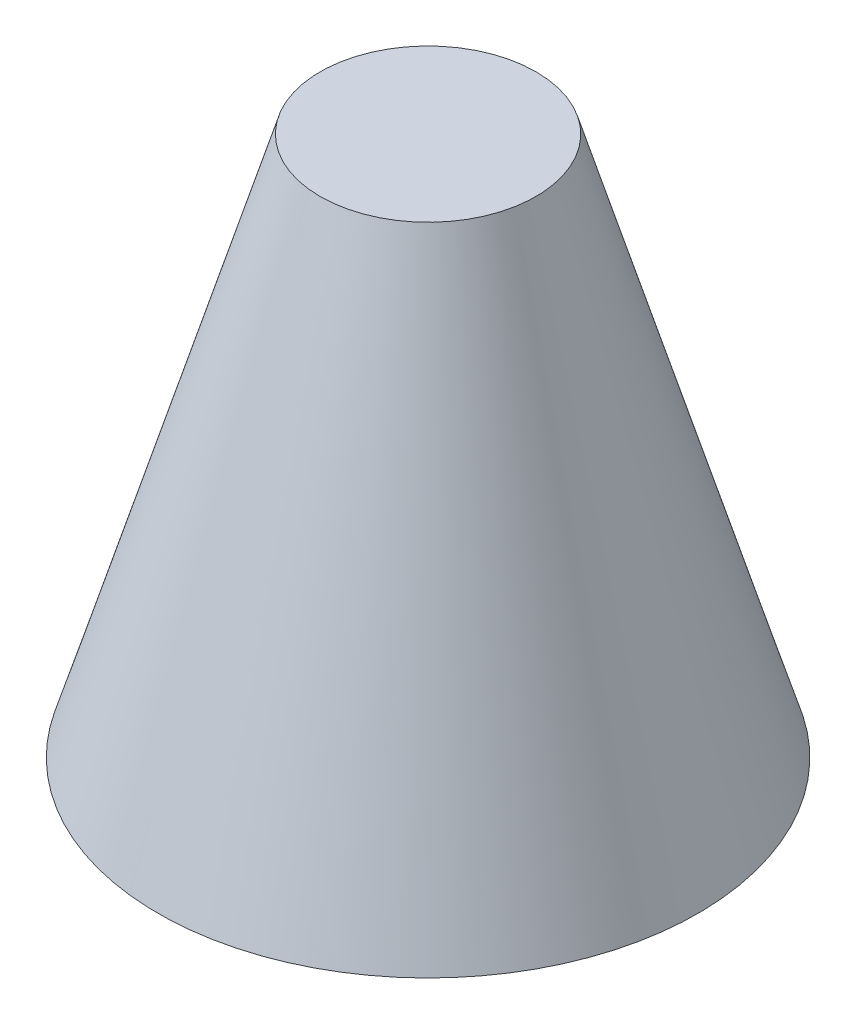
ISO-10303-21;
HEADER;
FILE_DESCRIPTION(('STEP AP214'),'2;1');
FILE_NAME('part.step','',(''),(''),'','','');
FILE_SCHEMA(('AUTOMOTIVE_DESIGN { 1 0 10303 214 1 1 1 1 }'));
ENDSEC;
DATA;
#1=APPLICATION_CONTEXT('core data for automotive mechanical design processes');
#2=APPLICATION_PROTOCOL_DEFINITION('international standard','automotive_design',2000,#1);
#3=PRODUCT_CONTEXT('',#1,'mechanical');
#4=PRODUCT('Part','Part','',(#3));
#5=PRODUCT_RELATED_PRODUCT_CATEGORY('part','',(#4));
#6=PRODUCT_DEFINITION_FORMATION('','',#4);
#7=PRODUCT_DEFINITION_CONTEXT('part definition',#1,'design');
#8=PRODUCT_DEFINITION('design','',#6,#7);
#9=PRODUCT_DEFINITION_SHAPE('','',#8);
#10=(LENGTH_UNIT() NAMED_UNIT(*) SI_UNIT(.MILLI.,.METRE.));
#11=(NAMED_UNIT(*) PLANE_ANGLE_UNIT() SI_UNIT($,.RADIAN.));
#12=(NAMED_UNIT(*) SI_UNIT($,.STERADIAN.) SOLID_ANGLE_UNIT());
#13=UNCERTAINTY_MEASURE_WITH_UNIT(LENGTH_MEASURE(1.E-05),#10,'distance_accuracy_value','');
#14=(GEOMETRIC_REPRESENTATION_CONTEXT(3) GLOBAL_UNCERTAINTY_ASSIGNED_CONTEXT((#13)) GLOBAL_UNIT_ASSIGNED_CONTEXT((#10,
#11,#12)) REPRESENTATION_CONTEXT('',''));
#15=CARTESIAN_POINT('',(0.,0.,0.));
#16=DIRECTION('',(0.,0.,1.));
#17=DIRECTION('',(1.,0.,0.));
#18=AXIS2_PLACEMENT_3D('',#15,#16,#17);
#19=CARTESIAN_POINT('',(0.,0.,0.));
#20=DIRECTION('',(0.,-1.,0.));
#21=DIRECTION('',(0.,0.,-1.));
#22=AXIS2_PLACEMENT_3D('',#19,#20,#21);
#23=PLANE('',#22);
#24=CARTESIAN_POINT('',(0.,0.,0.));
#25=DIRECTION('',(0.,1.,0.));
#26=DIRECTION('',(0.,0.,1.));
#27=AXIS2_PLACEMENT_3D('',#24,#25,#26);
#28=CIRCLE('',#27,4.);
#29=CARTESIAN_POINT('',(0.,0.,4.));
#30=VERTEX_POINT('',#29);
#31=EDGE_CURVE('E51',#30,#30,#28,.T.);
#32=ORIENTED_EDGE('',*,*,#31,.T.);
#33=EDGE_LOOP('',(#32));
#34=FACE_BOUND('',#33,.T.);
#35=CARTESIAN_POINT('',(0.,0.,0.));
#36=DIRECTION('',(0.,-1.,0.));
#37=DIRECTION('',(0.,0.,-1.));
#38=AXIS2_PLACEMENT_3D('',#35,#36,#37);
#39=CIRCLE('',#38,50.);
#40=CARTESIAN_POINT('',(0.,0.,-50.));
#41=VERTEX_POINT('',#40);
#42=EDGE_CURVE('E10',#41,#41,#39,.T.);
#43=ORIENTED_EDGE('',*,*,#42,.T.);
#44=EDGE_LOOP('',(#43));
#45=FACE_BOUND('',#44,.T.);
#46=ADVANCED_FACE('F37',(#34,#45),#23,.T.);
#47=CARTESIAN_POINT('',(0.,0.,0.));
#48=DIRECTION('',(0.,-1.,0.));
#49=DIRECTION('',(0.,0.,-1.));
#50=AXIS2_PLACEMENT_3D('',#47,#48,#49);
#51=CONICAL_SURFACE('',#50,50.,0.291456794477867);
#52=CARTESIAN_POINT('',(0.,100.,0.));
#53=DIRECTION('',(0.,-1.,0.));
#54=DIRECTION('',(0.,0.,-1.));
#55=AXIS2_PLACEMENT_3D('',#52,#53,#54);
#56=CIRCLE('',#55,20.);
#57=CARTESIAN_POINT('',(0.,100.,-20.));
#58=VERTEX_POINT('',#57);
#59=EDGE_CURVE('E43',#58,#58,#56,.T.);
#60=ORIENTED_EDGE('',*,*,#59,.T.);
#61=EDGE_LOOP('',(#60));
#62=FACE_BOUND('',#61,.T.);
#63=ORIENTED_EDGE('',*,*,#42,.F.);
#64=EDGE_LOOP('',(#63));
#65=FACE_BOUND('',#64,.T.);
#66=ADVANCED_FACE('F71',(#62,#65),#51,.T.);
#67=CARTESIAN_POINT('',(20.,100.,0.));
#68=DIRECTION('',(0.,1.,0.));
#69=DIRECTION('',(0.,0.,1.));
#70=AXIS2_PLACEMENT_3D('',#67,#68,#69);
#71=PLANE('',#70);
#72=ORIENTED_EDGE('',*,*,#59,.F.);
#73=EDGE_LOOP('',(#72));
#74=FACE_BOUND('',#73,.T.);
#75=ADVANCED_FACE('F61',(#74),#71,.T.);
#76=CARTESIAN_POINT('',(0.,14.,0.));
#77=DIRECTION('',(0.,-1.,0.));
#78=DIRECTION('',(0.,0.,-1.));
#79=AXIS2_PLACEMENT_3D('',#76,#77,#78);
#80=CYLINDRICAL_SURFACE('',#79,4.);
#81=CARTESIAN_POINT('',(0.,14.,0.));
#82=DIRECTION('',(0.,1.,0.));
#83=DIRECTION('',(0.,0.,1.));
#84=AXIS2_PLACEMENT_3D('',#81,#82,#83);
#85=CIRCLE('',#84,4.);
#86=CARTESIAN_POINT('',(0.,14.,4.));
#87=VERTEX_POINT('',#86);
#88=EDGE_CURVE('E47',#87,#87,#85,.T.);
#89=ORIENTED_EDGE('',*,*,#88,.T.);
#90=EDGE_LOOP('',(#89));
#91=FACE_BOUND('',#90,.T.);
#92=ORIENTED_EDGE('',*,*,#31,.F.);
#93=EDGE_LOOP('',(#92));
#94=FACE_BOUND('',#93,.T.);
#95=ADVANCED_FACE('F58',(#91,#94),#80,.F.);
#96=CARTESIAN_POINT('',(0.,14.,0.));
#97=DIRECTION('',(0.,1.,0.));
#98=DIRECTION('',(0.,0.,1.));
#99=AXIS2_PLACEMENT_3D('',#96,#97,#98);
#100=PLANE('',#99);
#101=ORIENTED_EDGE('',*,*,#88,.F.);
#102=EDGE_LOOP('',(#101));
#103=FACE_BOUND('',#102,.T.);
#104=ADVANCED_FACE('F60',(#103),#100,.F.);
#105=CLOSED_SHELL('',(#46,#66,#75,#95,#104));
#106=MANIFOLD_SOLID_BREP('B2',#105);
#107=ADVANCED_BREP_SHAPE_REPRESENTATION('',(#18,#106),#14);
#108=SHAPE_DEFINITION_REPRESENTATION(#9,#107);
ENDSEC;
END-ISO-10303-21;
